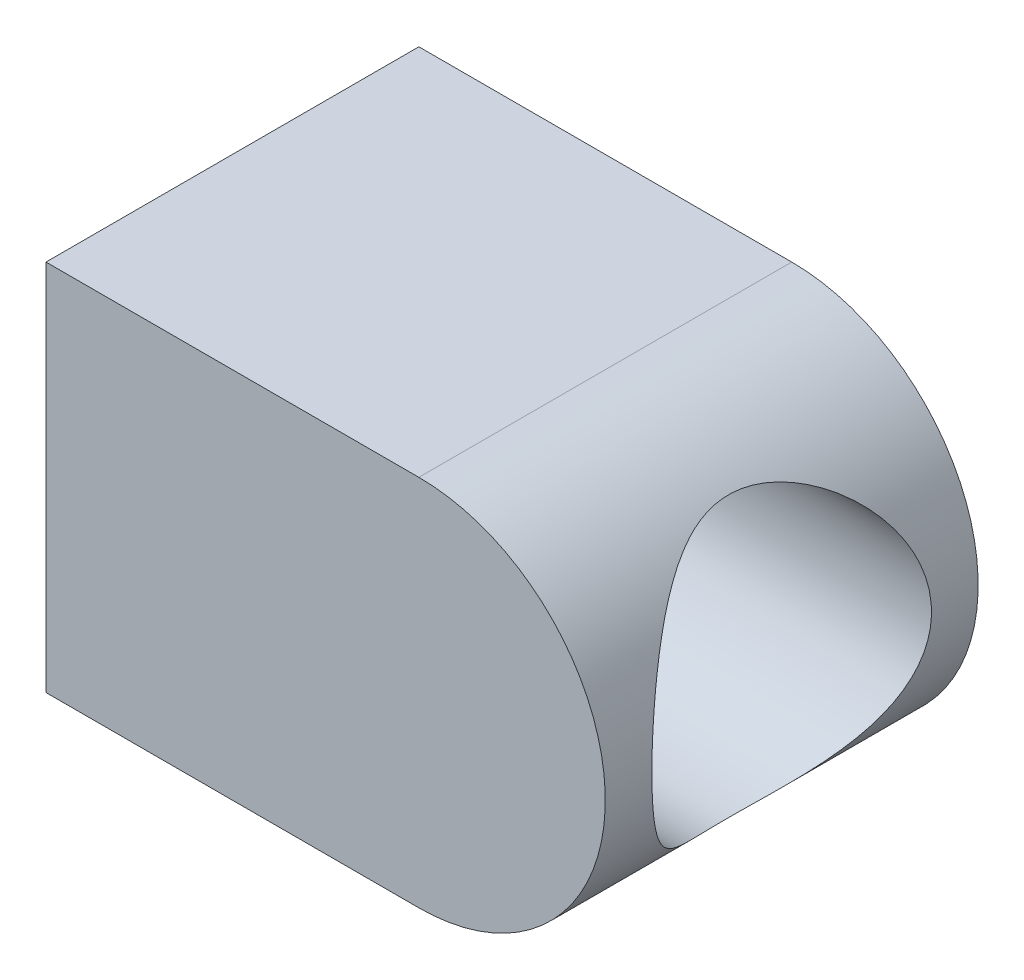
ISO-10303-21;
HEADER;
FILE_DESCRIPTION(('STEP AP214'),'2;1');
FILE_NAME('part.step','',(''),(''),'','','');
FILE_SCHEMA(('AUTOMOTIVE_DESIGN { 1 0 10303 214 1 1 1 1 }'));
ENDSEC;
DATA;
#1=APPLICATION_CONTEXT('core data for automotive mechanical design processes');
#2=APPLICATION_PROTOCOL_DEFINITION('international standard','automotive_design',2000,#1);
#3=PRODUCT_CONTEXT('',#1,'mechanical');
#4=PRODUCT('Part','Part','',(#3));
#5=PRODUCT_RELATED_PRODUCT_CATEGORY('part','',(#4));
#6=PRODUCT_DEFINITION_FORMATION('','',#4);
#7=PRODUCT_DEFINITION_CONTEXT('part definition',#1,'design');
#8=PRODUCT_DEFINITION('design','',#6,#7);
#9=PRODUCT_DEFINITION_SHAPE('','',#8);
#10=(LENGTH_UNIT() NAMED_UNIT(*) SI_UNIT(.MILLI.,.METRE.));
#11=(NAMED_UNIT(*) PLANE_ANGLE_UNIT() SI_UNIT($,.RADIAN.));
#12=(NAMED_UNIT(*) SI_UNIT($,.STERADIAN.) SOLID_ANGLE_UNIT());
#13=UNCERTAINTY_MEASURE_WITH_UNIT(LENGTH_MEASURE(1.E-05),#10,'distance_accuracy_value','');
#14=(GEOMETRIC_REPRESENTATION_CONTEXT(3) GLOBAL_UNCERTAINTY_ASSIGNED_CONTEXT((#13)) GLOBAL_UNIT_ASSIGNED_CONTEXT((#10,
#11,#12)) REPRESENTATION_CONTEXT('',''));
#15=CARTESIAN_POINT('',(0.,0.,0.));
#16=DIRECTION('',(0.,0.,1.));
#17=DIRECTION('',(1.,0.,0.));
#18=AXIS2_PLACEMENT_3D('',#15,#16,#17);
#19=CARTESIAN_POINT('',(20.,0.,10.));
#20=DIRECTION('',(0.,0.,1.));
#21=DIRECTION('',(0.,-1.,0.));
#22=AXIS2_PLACEMENT_3D('',#19,#20,#21);
#23=CYLINDRICAL_SURFACE('',#22,10.);
#24=CARTESIAN_POINT('',(30.,0.,7.5));
#25=CARTESIAN_POINT('',(29.9999982522004,-0.183148360631224,7.49999818893739));
#26=CARTESIAN_POINT('',(29.9949562173144,-0.366342585140464,7.49327904355369));
#27=CARTESIAN_POINT('',(29.9749014309751,-0.731284647804647,7.4665075354722));
#28=CARTESIAN_POINT('',(29.9598827133907,-0.913031554599345,7.44644719463124));
#29=CARTESIAN_POINT('',(29.9201917868147,-1.27389276294165,7.39327524669788));
#30=CARTESIAN_POINT('',(29.8955011832214,-1.45300136929127,7.36013876969516));
#31=CARTESIAN_POINT('',(29.8370217264005,-1.8069893726824,7.28132496783567));
#32=CARTESIAN_POINT('',(29.8032288122124,-1.98186684397495,7.23564204525219));
#33=CARTESIAN_POINT('',(29.7275237812858,-2.32506995293138,7.13273632169166));
#34=CARTESIAN_POINT('',(29.6856665671512,-2.49343113760904,7.07559145248382));
#35=CARTESIAN_POINT('',(29.5945148940036,-2.82395570771372,6.95029166291764));
#36=CARTESIAN_POINT('',(29.5452174929203,-2.98611660943024,6.88213238637889));
#37=CARTESIAN_POINT('',(29.3875684301135,-3.46192400316672,6.66235213297739));
#38=CARTESIAN_POINT('',(29.2693577301146,-3.76534217699647,6.49529215744356));
#39=CARTESIAN_POINT('',(29.0024708318156,-4.36738031046613,6.10867070715089));
#40=CARTESIAN_POINT('',(28.8519871218984,-4.66295396944976,5.88568000508899));
#41=CARTESIAN_POINT('',(28.5383291658828,-5.21514803427101,5.40250413548388));
#42=CARTESIAN_POINT('',(28.3751355077283,-5.47170701559805,5.14226154387884));
#43=CARTESIAN_POINT('',(28.1123054849366,-5.84983236323795,4.69866075176477));
#44=CARTESIAN_POINT('',(28.0132227206178,-5.98448699541009,4.5259238219425));
#45=CARTESIAN_POINT('',(27.8169223730435,-6.23870842573754,4.16852807024381));
#46=CARTESIAN_POINT('',(27.719705359681,-6.35827067422417,3.98386567862041));
#47=CARTESIAN_POINT('',(27.5302444339641,-6.58155279088788,3.60302886268602));
#48=CARTESIAN_POINT('',(27.4379956114613,-6.68528849377295,3.40686622028473));
#49=CARTESIAN_POINT('',(27.2619499259544,-6.87611265864527,3.00315708208778));
#50=CARTESIAN_POINT('',(27.1781482641012,-6.96321059804277,2.79561715440287));
#51=CARTESIAN_POINT('',(26.9988595671994,-7.14400878104046,2.30254645238824));
#52=CARTESIAN_POINT('',(26.9078729915952,-7.23130376139035,2.01287098199457));
#53=CARTESIAN_POINT('',(26.7958270569247,-7.33616747091051,1.56653027604641));
#54=CARTESIAN_POINT('',(26.7625626495277,-7.36676563602348,1.41586731334726));
#55=CARTESIAN_POINT('',(26.70541097181,-7.41882486802788,1.11124833153775));
#56=CARTESIAN_POINT('',(26.6815188695914,-7.44029064361234,0.957294052553735));
#57=CARTESIAN_POINT('',(26.6439948735184,-7.4738195774795,0.645615327330734));
#58=CARTESIAN_POINT('',(26.6304622423068,-7.48579180837431,0.487868987893117));
#59=CARTESIAN_POINT('',(26.6147101371017,-7.49971481213819,0.171366422876124));
#60=CARTESIAN_POINT('',(26.6124903526924,-7.50166585998078,0.012610225126162));
#61=CARTESIAN_POINT('',(26.61948621008,-7.49549374588534,-0.304507045808243));
#62=CARTESIAN_POINT('',(26.6287055945146,-7.48736728681514,-0.462867972679725));
#63=CARTESIAN_POINT('',(26.6580933344763,-7.46124382754021,-0.777706794403378));
#64=CARTESIAN_POINT('',(26.6782618015552,-7.44324672677111,-0.934184670053988));
#65=CARTESIAN_POINT('',(26.7484099547656,-7.37988631197293,-1.36574968700963));
#66=CARTESIAN_POINT('',(26.8093643810253,-7.32413018954154,-1.63760556702178));
#67=CARTESIAN_POINT('',(26.9557031079285,-7.18527767988214,-2.16727075528377));
#68=CARTESIAN_POINT('',(27.0411108793006,-7.10215501424415,-2.42506628380306));
#69=CARTESIAN_POINT('',(27.2109915390068,-6.92917382263755,-2.87816948326137));
#70=CARTESIAN_POINT('',(27.2926635132793,-6.84346833605325,-3.07615942386405));
#71=CARTESIAN_POINT('',(27.4634216590128,-6.65682611972849,-3.46158098312004));
#72=CARTESIAN_POINT('',(27.5525116222897,-6.55588157861579,-3.64900711882321));
#73=CARTESIAN_POINT('',(27.7351782312031,-6.33933222593356,-4.01346383598491));
#74=CARTESIAN_POINT('',(27.8287638067845,-6.22369741624747,-4.19047202972944));
#75=CARTESIAN_POINT('',(28.0176155368155,-5.97844426893636,-4.53350288415265));
#76=CARTESIAN_POINT('',(28.1128814258188,-5.84882812374303,-4.69952726064986));
#77=CARTESIAN_POINT('',(28.3052145331995,-5.57247402890015,-5.02435495191596));
#78=CARTESIAN_POINT('',(28.4022664993602,-5.42538639972571,-5.18287009523838));
#79=CARTESIAN_POINT('',(28.5935031315706,-5.11709028531976,-5.4874712931344));
#80=CARTESIAN_POINT('',(28.6876875066085,-4.95588037331082,-5.63355608892123));
#81=CARTESIAN_POINT('',(28.8708932479542,-4.61993509999967,-5.9121685815808));
#82=CARTESIAN_POINT('',(28.9599230830712,-4.44522309293499,-6.04471880595067));
#83=CARTESIAN_POINT('',(29.1309047264298,-4.0824934348789,-6.29538049815266));
#84=CARTESIAN_POINT('',(29.2128583409965,-3.89447920193418,-6.41349565399721));
#85=CARTESIAN_POINT('',(29.3521181353367,-3.54483535127364,-6.61181062254776));
#86=CARTESIAN_POINT('',(29.4110713752602,-3.3854749988014,-6.69486397879262));
#87=CARTESIAN_POINT('',(29.5221146003125,-3.05924910859919,-6.85008087841822));
#88=CARTESIAN_POINT('',(29.5742059963837,-2.89238512327235,-6.92224666096277));
#89=CARTESIAN_POINT('',(29.6705201589657,-2.55192522953366,-7.05485907633048));
#90=CARTESIAN_POINT('',(29.7147458706395,-2.37833187059298,-7.11531009629737));
#91=CARTESIAN_POINT('',(29.7944303324846,-2.02530797337889,-7.22372599838246));
#92=CARTESIAN_POINT('',(29.829888970063,-1.84587736017292,-7.27169072014339));
#93=CARTESIAN_POINT('',(29.8914266821587,-1.48124003999791,-7.35466532282744));
#94=CARTESIAN_POINT('',(29.9174457888285,-1.29600425567115,-7.38959241691325));
#95=CARTESIAN_POINT('',(29.9591542327858,-0.922276966538737,-7.44547510633095));
#96=CARTESIAN_POINT('',(29.9748435449205,-0.733785453806581,-7.46643066764234));
#97=CARTESIAN_POINT('',(29.9954855530348,-0.355230498112982,-7.49398524474109));
#98=CARTESIAN_POINT('',(30.0004418293711,-0.165167600582669,-7.50058904803143));
#99=CARTESIAN_POINT('',(29.9994964020627,0.214874139571317,-7.49932859377682));
#100=CARTESIAN_POINT('',(29.9935955540124,0.404852987638413,-7.49146547629586));
#101=CARTESIAN_POINT('',(29.972233059948,0.763928127056922,-7.46294236973792));
#102=CARTESIAN_POINT('',(29.9577961888837,0.933197305435485,-7.44365365800734));
#103=CARTESIAN_POINT('',(29.920571335535,1.26918880187071,-7.39378195048397));
#104=CARTESIAN_POINT('',(29.8977805689378,1.43591025146061,-7.36319518908004));
#105=CARTESIAN_POINT('',(29.8443076773392,1.76564432096826,-7.29115734942134));
#106=CARTESIAN_POINT('',(29.8136274799955,1.92865783628605,-7.2497089249952));
#107=CARTESIAN_POINT('',(29.7449361877716,2.25016822648629,-7.15644992271478));
#108=CARTESIAN_POINT('',(29.7069222237783,2.40866330572276,-7.10463528910178));
#109=CARTESIAN_POINT('',(29.6227903410768,2.72575422161848,-6.98925664363567));
#110=CARTESIAN_POINT('',(29.57643622072,2.88416117889076,-6.92534617410772));
#111=CARTESIAN_POINT('',(29.4773892424898,3.19463271777294,-6.78772294909282));
#112=CARTESIAN_POINT('',(29.4246942300177,3.34669511976835,-6.714006860811));
#113=CARTESIAN_POINT('',(29.2583939846392,3.79243668836605,-6.47920692417676));
#114=CARTESIAN_POINT('',(29.1365080954707,4.07590942242921,-6.30438302984448));
#115=CARTESIAN_POINT('',(28.855926898612,4.65763303463208,-5.89103887573372));
#116=CARTESIAN_POINT('',(28.6944836950979,4.95044606090117,-5.6467569844664));
#117=CARTESIAN_POINT('',(28.445168814621,5.35767107336566,-5.25178529657187));
#118=CARTESIAN_POINT('',(28.3607423474194,5.4882491820926,-5.11514721416235));
#119=CARTESIAN_POINT('',(28.1910090465296,5.73848345968049,-4.83274071227057));
#120=CARTESIAN_POINT('',(28.1057024263051,5.85814221058998,-4.68697446510082));
#121=CARTESIAN_POINT('',(27.9196119639186,6.10806144849819,-4.3579836003852));
#122=CARTESIAN_POINT('',(27.8189731729329,6.23600392340882,-4.17291057659886));
#123=CARTESIAN_POINT('',(27.6216862759629,6.47564568677308,-3.79037795234807));
#124=CARTESIAN_POINT('',(27.525039645496,6.58733900727102,-3.5929138388307));
#125=CARTESIAN_POINT('',(27.3395895047088,6.79334858159907,-3.18626014428688));
#126=CARTESIAN_POINT('',(27.2507678217486,6.88770568215121,-2.9770996801148));
#127=CARTESIAN_POINT('',(27.0850381039346,7.05807032553021,-2.54696871906798));
#128=CARTESIAN_POINT('',(27.0081202111329,7.13409308112476,-2.32600820044611));
#129=CARTESIAN_POINT('',(26.8977653690009,7.24045739920368,-1.96126342009718));
#130=CARTESIAN_POINT('',(26.8590510506574,7.27706722475707,-1.82087864942204));
#131=CARTESIAN_POINT('',(26.789092156193,7.34237828490353,-1.53647343230706));
#132=CARTESIAN_POINT('',(26.7578449586773,7.37108229544015,-1.39245428143496));
#133=CARTESIAN_POINT('',(26.7039777284579,7.42010866141178,-1.1016728535583));
#134=CARTESIAN_POINT('',(26.681341757216,7.4404465075322,-0.954916177061123));
#135=CARTESIAN_POINT('',(26.6455365994769,7.47244433482206,-0.659297787730881));
#136=CARTESIAN_POINT('',(26.6323674368992,7.48410429406539,-0.510436069580052));
#137=CARTESIAN_POINT('',(26.6160439268707,7.49853887636308,-0.210954386526908));
#138=CARTESIAN_POINT('',(26.6129415731043,7.5012673702604,-0.0603293133359535));
#139=CARTESIAN_POINT('',(26.6170441038311,7.49764855771467,0.240665071001235));
#140=CARTESIAN_POINT('',(26.6242487717127,7.491301442004,0.391034387455943));
#141=CARTESIAN_POINT('',(26.6486404222195,7.46966150960367,0.690440338840025));
#142=CARTESIAN_POINT('',(26.6658365386643,7.45436050750457,0.839475627499704));
#143=CARTESIAN_POINT('',(26.709472718225,7.41510828933917,1.13508703725527));
#144=CARTESIAN_POINT('',(26.7359176843515,7.39115248495673,1.28166181070301));
#145=CARTESIAN_POINT('',(26.8036699176971,7.32888993758964,1.60301856305019));
#146=CARTESIAN_POINT('',(26.8469591142457,7.28859466709028,1.77699756145149));
#147=CARTESIAN_POINT('',(26.9436074963383,7.19657956576836,2.1191194152513));
#148=CARTESIAN_POINT('',(26.9969742778718,7.14485111212704,2.28725775432345));
#149=CARTESIAN_POINT('',(27.111732855852,7.03063417120002,2.61739484443178));
#150=CARTESIAN_POINT('',(27.1731404908542,6.96812436806886,2.77938064200082));
#151=CARTESIAN_POINT('',(27.3018969695742,6.83308175773697,3.09656264174573));
#152=CARTESIAN_POINT('',(27.3692440007334,6.76055200457875,3.25176089383472));
#153=CARTESIAN_POINT('',(27.5322752734048,6.57908862155701,3.60808559236013));
#154=CARTESIAN_POINT('',(27.6296794960461,6.46625899136202,3.80644895969006));
#155=CARTESIAN_POINT('',(27.8284879754224,6.22409397674892,4.19073439177032));
#156=CARTESIAN_POINT('',(27.9298934716699,6.09475344941422,4.37665255238673));
#157=CARTESIAN_POINT('',(28.133686786156,5.82000166017292,4.73589981751336));
#158=CARTESIAN_POINT('',(28.2360752869358,5.67457836362909,4.90921933160679));
#159=CARTESIAN_POINT('',(28.4390261517992,5.36811116429771,5.24257893236507));
#160=CARTESIAN_POINT('',(28.5395887360584,5.20706915992245,5.4026206285367));
#161=CARTESIAN_POINT('',(28.7372240474276,4.86823444610668,5.70990657217634));
#162=CARTESIAN_POINT('',(28.8342603291238,4.69031229919782,5.8570319241357));
#163=CARTESIAN_POINT('',(29.0214820988581,4.31926384766125,6.13577999179689));
#164=CARTESIAN_POINT('',(29.1116666906167,4.12613556060168,6.26740068054642));
#165=CARTESIAN_POINT('',(29.2825625357414,3.72576429558787,6.51335316526435));
#166=CARTESIAN_POINT('',(29.3632916756504,3.51854917893226,6.62771772621554));
#167=CARTESIAN_POINT('',(29.5130447151083,3.09083237545736,6.83764805177308));
#168=CARTESIAN_POINT('',(29.5820746530538,2.87033762289902,6.93322351823475));
#169=CARTESIAN_POINT('',(29.6879652612672,2.48412405824608,7.0787264227465));
#170=CARTESIAN_POINT('',(29.728324829459,2.32129005811085,7.13382299148816));
#171=CARTESIAN_POINT('',(29.801325496035,1.99064201184581,7.23305703982988));
#172=CARTESIAN_POINT('',(29.8339684685648,1.82282918610054,7.27719718057103));
#173=CARTESIAN_POINT('',(29.8908281821323,1.4835883949454,7.35385209547679));
#174=CARTESIAN_POINT('',(29.9150643996245,1.31216977477246,7.38639374547649));
#175=CARTESIAN_POINT('',(29.954698557198,0.966540401338083,7.43951195899649));
#176=CARTESIAN_POINT('',(29.9701010169854,0.79233112287527,7.46009464127692));
#177=CARTESIAN_POINT('',(29.9872675187777,0.514835906933092,7.48301680158298));
#178=CARTESIAN_POINT('',(29.9920379273974,0.412044960462379,7.48938115186711));
#179=CARTESIAN_POINT('',(29.9984049153868,0.20617421598106,7.49787360177284));
#180=CARTESIAN_POINT('',(30.0000009838379,0.103094374145227,7.50000101944875));
#181=CARTESIAN_POINT('',(30.,0.,7.5));
#182=B_SPLINE_CURVE_WITH_KNOTS('',3,(#24,#25,#26,#27,#28,#29,#30,#31,#32,#33,#34,#35,#36,#37,
#38,#39,#40,#41,#42,#43,#44,#45,#46,#47,#48,#49,#50,#51,#52,#53,#54,#55,#56,#57,#58,#59,#60,#61,
#62,#63,#64,#65,#66,#67,#68,#69,#70,#71,#72,#73,#74,#75,#76,#77,#78,#79,#80,#81,#82,#83,#84,#85,
#86,#87,#88,#89,#90,#91,#92,#93,#94,#95,#96,#97,#98,#99,#100,#101,#102,#103,#104,#105,#106,#107,
#108,#109,#110,#111,#112,#113,#114,#115,#116,#117,#118,#119,#120,#121,#122,#123,#124,#125,#126,
#127,#128,#129,#130,#131,#132,#133,#134,#135,#136,#137,#138,#139,#140,#141,#142,#143,#144,#145,
#146,#147,#148,#149,#150,#151,#152,#153,#154,#155,#156,#157,#158,#159,#160,#161,#162,#163,#164,
#165,#166,#167,#168,#169,#170,#171,#172,#173,#174,#175,#176,#177,#178,#179,#180,#181),
.UNSPECIFIED.,.T.,.F.,(4,2,2,2,2,2,2,2,2,2,2,2,2,2,2,2,2,2,2,2,2,2,2,2,2,2,2,2,2,2,2,2,2,2,2,2,
2,2,2,2,2,2,2,2,2,2,2,2,2,2,2,2,2,2,2,2,2,2,2,2,2,2,2,2,2,2,2,2,2,2,2,2,2,2,2,2,2,2,4),(0.,
0.549333810396349,1.09899642261334,1.64970953325451,2.20066875053375,2.74800168216962,
3.2955516152897,4.38923194166926,5.58419151329428,6.78101336768092,7.50152042078937,
8.22224415798694,8.94224200290018,9.66182848258839,10.6057257062582,11.0771415311411,
11.5483139968762,12.0239465220089,12.4995659960823,12.9753411231469,13.4511210976087,
14.3000658907337,15.1498282626302,15.8409837223713,16.5324946713612,17.2254411215001,
17.9182790673241,18.6286106705283,19.3390141216436,20.0482151836289,20.7572346715093,
21.3240789510858,21.8908064927599,22.4573213847599,23.0238435519584,23.5939042031105,
24.163966242347,24.733838089351,25.3036650295946,25.8159956353881,26.3284971539712,
26.8408735696905,27.3534508450853,27.8838865184232,28.4145029424249,29.4749536671179,
30.7125000722884,31.3331067040452,31.9535662015579,32.6921380168984,33.4309804122227,
34.168059012369,34.9045239072425,35.3546199278826,35.804557705681,36.2536585931601,
36.7027606153631,37.1541785263257,37.6055869504596,38.0574086864991,38.5094703067444,
39.0599080061886,39.610762266734,40.1627183763172,40.7145066214401,41.4578805109439,
42.2014865187518,42.9456527762345,43.6897286953816,44.440059867972,45.1904890240892,
45.9394748739468,46.6880729590085,47.2172824489512,47.7463632763237,48.2742100312628,
48.801786477061,49.1109572068324,49.4201776944439),.UNSPECIFIED.);
#183=CARTESIAN_POINT('',(30.,0.,7.5));
#184=VERTEX_POINT('',#183);
#185=EDGE_CURVE('E112',#184,#184,#182,.T.);
#186=ORIENTED_EDGE('',*,*,#185,.F.);
#187=EDGE_LOOP('',(#186));
#188=FACE_BOUND('',#187,.T.);
#189=DIRECTION('',(0.,0.,-1.));
#190=VECTOR('',#189,1.);
#191=CARTESIAN_POINT('',(20.,10.,10.));
#192=LINE('',#191,#190);
#193=CARTESIAN_POINT('',(20.,10.,10.));
#194=VERTEX_POINT('',#193);
#195=CARTESIAN_POINT('',(20.,10.,-10.));
#196=VERTEX_POINT('',#195);
#197=EDGE_CURVE('E95',#194,#196,#192,.T.);
#198=ORIENTED_EDGE('',*,*,#197,.F.);
#199=CARTESIAN_POINT('',(20.,0.,10.));
#200=DIRECTION('',(0.,0.,-1.));
#201=DIRECTION('',(-1.,0.,0.));
#202=AXIS2_PLACEMENT_3D('',#199,#200,#201);
#203=CIRCLE('',#202,10.);
#204=CARTESIAN_POINT('',(20.,-10.,10.));
#205=VERTEX_POINT('',#204);
#206=EDGE_CURVE('E55',#205,#194,#203,.F.);
#207=ORIENTED_EDGE('',*,*,#206,.F.);
#208=DIRECTION('',(0.,0.,-1.));
#209=VECTOR('',#208,1.);
#210=CARTESIAN_POINT('',(20.,-10.,10.));
#211=LINE('',#210,#209);
#212=CARTESIAN_POINT('',(20.,-10.,-10.));
#213=VERTEX_POINT('',#212);
#214=EDGE_CURVE('E91',#213,#205,#211,.F.);
#215=ORIENTED_EDGE('',*,*,#214,.F.);
#216=CARTESIAN_POINT('',(20.,0.,-10.));
#217=DIRECTION('',(0.,0.,1.));
#218=DIRECTION('',(1.,0.,0.));
#219=AXIS2_PLACEMENT_3D('',#216,#217,#218);
#220=CIRCLE('',#219,10.);
#221=EDGE_CURVE('E11',#196,#213,#220,.F.);
#222=ORIENTED_EDGE('',*,*,#221,.F.);
#223=EDGE_LOOP('',(#198,#207,#215,#222));
#224=FACE_BOUND('',#223,.T.);
#225=ADVANCED_FACE('F45',(#188,#224),#23,.T.);
#226=CARTESIAN_POINT('',(30.,-10.,10.));
#227=DIRECTION('',(0.,0.,-1.));
#228=DIRECTION('',(-1.,0.,0.));
#229=AXIS2_PLACEMENT_3D('',#226,#227,#228);
#230=PLANE('',#229);
#231=DIRECTION('',(-1.,0.,0.));
#232=VECTOR('',#231,1.);
#233=CARTESIAN_POINT('',(30.,-10.,10.));
#234=LINE('',#233,#232);
#235=CARTESIAN_POINT('',(0.,-10.,10.));
#236=VERTEX_POINT('',#235);
#237=EDGE_CURVE('E85',#205,#236,#234,.T.);
#238=ORIENTED_EDGE('',*,*,#237,.F.);
#239=ORIENTED_EDGE('',*,*,#206,.T.);
#240=DIRECTION('',(-1.,0.,0.));
#241=VECTOR('',#240,1.);
#242=CARTESIAN_POINT('',(30.,10.,10.));
#243=LINE('',#242,#241);
#244=CARTESIAN_POINT('',(0.,10.,10.));
#245=VERTEX_POINT('',#244);
#246=EDGE_CURVE('E109',#194,#245,#243,.T.);
#247=ORIENTED_EDGE('',*,*,#246,.T.);
#248=DIRECTION('',(0.,-1.,0.));
#249=VECTOR('',#248,1.);
#250=CARTESIAN_POINT('',(0.,-10.,10.));
#251=LINE('',#250,#249);
#252=EDGE_CURVE('E102',#245,#236,#251,.T.);
#253=ORIENTED_EDGE('',*,*,#252,.T.);
#254=EDGE_LOOP('',(#238,#239,#247,#253));
#255=FACE_BOUND('',#254,.T.);
#256=ADVANCED_FACE('F107',(#255),#230,.F.);
#257=CARTESIAN_POINT('',(30.,-10.,-10.));
#258=DIRECTION('',(0.,1.,0.));
#259=DIRECTION('',(0.,0.,1.));
#260=AXIS2_PLACEMENT_3D('',#257,#258,#259);
#261=PLANE('',#260);
#262=DIRECTION('',(-1.,0.,0.));
#263=VECTOR('',#262,1.);
#264=CARTESIAN_POINT('',(30.,-10.,-10.));
#265=LINE('',#264,#263);
#266=CARTESIAN_POINT('',(0.,-10.,-10.));
#267=VERTEX_POINT('',#266);
#268=EDGE_CURVE('E96',#213,#267,#265,.T.);
#269=ORIENTED_EDGE('',*,*,#268,.F.);
#270=ORIENTED_EDGE('',*,*,#214,.T.);
#271=ORIENTED_EDGE('',*,*,#237,.T.);
#272=DIRECTION('',(0.,0.,-1.));
#273=VECTOR('',#272,1.);
#274=CARTESIAN_POINT('',(0.,-10.,-10.));
#275=LINE('',#274,#273);
#276=EDGE_CURVE('E89',#236,#267,#275,.T.);
#277=ORIENTED_EDGE('',*,*,#276,.T.);
#278=EDGE_LOOP('',(#269,#270,#271,#277));
#279=FACE_BOUND('',#278,.T.);
#280=ADVANCED_FACE('F88',(#279),#261,.F.);
#281=CARTESIAN_POINT('',(30.,-10.,-10.));
#282=DIRECTION('',(0.,0.,1.));
#283=DIRECTION('',(1.,0.,0.));
#284=AXIS2_PLACEMENT_3D('',#281,#282,#283);
#285=PLANE('',#284);
#286=DIRECTION('',(-1.,0.,0.));
#287=VECTOR('',#286,1.);
#288=CARTESIAN_POINT('',(30.,10.,-10.));
#289=LINE('',#288,#287);
#290=CARTESIAN_POINT('',(0.,10.,-10.));
#291=VERTEX_POINT('',#290);
#292=EDGE_CURVE('E131',#196,#291,#289,.T.);
#293=ORIENTED_EDGE('',*,*,#292,.F.);
#294=ORIENTED_EDGE('',*,*,#221,.T.);
#295=ORIENTED_EDGE('',*,*,#268,.T.);
#296=DIRECTION('',(0.,1.,0.));
#297=VECTOR('',#296,1.);
#298=CARTESIAN_POINT('',(0.,-10.,-10.));
#299=LINE('',#298,#297);
#300=EDGE_CURVE('E104',#267,#291,#299,.T.);
#301=ORIENTED_EDGE('',*,*,#300,.T.);
#302=EDGE_LOOP('',(#293,#294,#295,#301));
#303=FACE_BOUND('',#302,.T.);
#304=ADVANCED_FACE('F143',(#303),#285,.F.);
#305=CARTESIAN_POINT('',(30.,10.,-10.));
#306=DIRECTION('',(0.,-1.,0.));
#307=DIRECTION('',(0.,0.,-1.));
#308=AXIS2_PLACEMENT_3D('',#305,#306,#307);
#309=PLANE('',#308);
#310=ORIENTED_EDGE('',*,*,#246,.F.);
#311=ORIENTED_EDGE('',*,*,#197,.T.);
#312=ORIENTED_EDGE('',*,*,#292,.T.);
#313=DIRECTION('',(0.,0.,1.));
#314=VECTOR('',#313,1.);
#315=CARTESIAN_POINT('',(0.,10.,-10.));
#316=LINE('',#315,#314);
#317=EDGE_CURVE('E126',#291,#245,#316,.T.);
#318=ORIENTED_EDGE('',*,*,#317,.T.);
#319=EDGE_LOOP('',(#310,#311,#312,#318));
#320=FACE_BOUND('',#319,.T.);
#321=ADVANCED_FACE('F142',(#320),#309,.F.);
#322=CARTESIAN_POINT('',(0.,0.,0.));
#323=DIRECTION('',(1.,0.,0.));
#324=DIRECTION('',(0.,0.,-1.));
#325=AXIS2_PLACEMENT_3D('',#322,#323,#324);
#326=PLANE('',#325);
#327=CARTESIAN_POINT('',(0.,0.,0.));
#328=DIRECTION('',(-1.,0.,0.));
#329=DIRECTION('',(0.,0.,1.));
#330=AXIS2_PLACEMENT_3D('',#327,#328,#329);
#331=CIRCLE('',#330,7.5);
#332=CARTESIAN_POINT('',(0.,0.,7.5));
#333=VERTEX_POINT('',#332);
#334=EDGE_CURVE('E116',#333,#333,#331,.T.);
#335=ORIENTED_EDGE('',*,*,#334,.F.);
#336=EDGE_LOOP('',(#335));
#337=FACE_BOUND('',#336,.T.);
#338=ORIENTED_EDGE('',*,*,#252,.F.);
#339=ORIENTED_EDGE('',*,*,#317,.F.);
#340=ORIENTED_EDGE('',*,*,#300,.F.);
#341=ORIENTED_EDGE('',*,*,#276,.F.);
#342=EDGE_LOOP('',(#338,#339,#340,#341));
#343=FACE_BOUND('',#342,.T.);
#344=ADVANCED_FACE('F100',(#337,#343),#326,.F.);
#345=CARTESIAN_POINT('',(30.,0.,0.));
#346=DIRECTION('',(-1.,0.,0.));
#347=DIRECTION('',(0.,0.,1.));
#348=AXIS2_PLACEMENT_3D('',#345,#346,#347);
#349=CYLINDRICAL_SURFACE('',#348,7.5);
#350=ORIENTED_EDGE('',*,*,#185,.T.);
#351=EDGE_LOOP('',(#350));
#352=FACE_BOUND('',#351,.T.);
#353=ORIENTED_EDGE('',*,*,#334,.T.);
#354=EDGE_LOOP('',(#353));
#355=FACE_BOUND('',#354,.T.);
#356=ADVANCED_FACE('F159',(#352,#355),#349,.F.);
#357=CLOSED_SHELL('',(#225,#256,#280,#304,#321,#344,#356));
#358=MANIFOLD_SOLID_BREP('B2',#357);
#359=ADVANCED_BREP_SHAPE_REPRESENTATION('',(#18,#358),#14);
#360=SHAPE_DEFINITION_REPRESENTATION(#9,#359);
ENDSEC;
END-ISO-10303-21;
